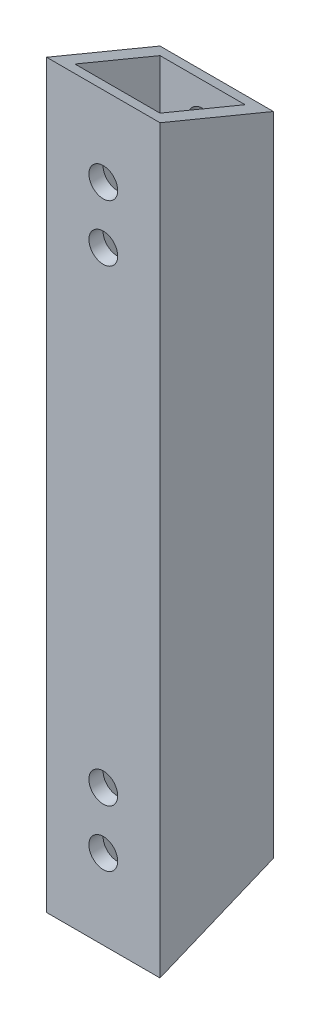
ISO-10303-21;
HEADER;
FILE_DESCRIPTION(('STEP AP214'),'2;1');
FILE_NAME('part.step','',(''),(''),'','','');
FILE_SCHEMA(('AUTOMOTIVE_DESIGN { 1 0 10303 214 1 1 1 1 }'));
ENDSEC;
DATA;
#1=APPLICATION_CONTEXT('core data for automotive mechanical design processes');
#2=APPLICATION_PROTOCOL_DEFINITION('international standard','automotive_design',2000,#1);
#3=PRODUCT_CONTEXT('',#1,'mechanical');
#4=PRODUCT('Part','Part','',(#3));
#5=PRODUCT_RELATED_PRODUCT_CATEGORY('part','',(#4));
#6=PRODUCT_DEFINITION_FORMATION('','',#4);
#7=PRODUCT_DEFINITION_CONTEXT('part definition',#1,'design');
#8=PRODUCT_DEFINITION('design','',#6,#7);
#9=PRODUCT_DEFINITION_SHAPE('','',#8);
#10=(LENGTH_UNIT() NAMED_UNIT(*) SI_UNIT(.MILLI.,.METRE.));
#11=(NAMED_UNIT(*) PLANE_ANGLE_UNIT() SI_UNIT($,.RADIAN.));
#12=(NAMED_UNIT(*) SI_UNIT($,.STERADIAN.) SOLID_ANGLE_UNIT());
#13=UNCERTAINTY_MEASURE_WITH_UNIT(LENGTH_MEASURE(1.E-05),#10,'distance_accuracy_value','');
#14=(GEOMETRIC_REPRESENTATION_CONTEXT(3) GLOBAL_UNCERTAINTY_ASSIGNED_CONTEXT((#13)) GLOBAL_UNIT_ASSIGNED_CONTEXT((#10,
#11,#12)) REPRESENTATION_CONTEXT('',''));
#15=CARTESIAN_POINT('',(0.,0.,0.));
#16=DIRECTION('',(0.,0.,1.));
#17=DIRECTION('',(1.,0.,0.));
#18=AXIS2_PLACEMENT_3D('',#15,#16,#17);
#19=CARTESIAN_POINT('',(-9.525,82.931,9.525));
#20=DIRECTION('',(0.,0.,-1.));
#21=DIRECTION('',(-1.,0.,0.));
#22=AXIS2_PLACEMENT_3D('',#19,#20,#21);
#23=PLANE('',#22);
#24=CARTESIAN_POINT('',(0.,-65.0439755157236,9.525));
#25=DIRECTION('',(0.,0.,-1.));
#26=DIRECTION('',(-1.,0.,0.));
#27=AXIS2_PLACEMENT_3D('',#24,#25,#26);
#28=CIRCLE('',#27,3.22238805970149);
#29=CARTESIAN_POINT('',(-3.22238805970149,-65.0439755157236,9.525));
#30=VERTEX_POINT('',#29);
#31=EDGE_CURVE('E173',#30,#30,#28,.T.);
#32=ORIENTED_EDGE('',*,*,#31,.F.);
#33=EDGE_LOOP('',(#32));
#34=FACE_BOUND('',#33,.T.);
#35=CARTESIAN_POINT('',(0.,52.3439755157236,9.525));
#36=DIRECTION('',(0.,0.,-1.));
#37=DIRECTION('',(-1.,0.,0.));
#38=AXIS2_PLACEMENT_3D('',#35,#36,#37);
#39=CIRCLE('',#38,3.22238805970149);
#40=CARTESIAN_POINT('',(-3.22238805970149,52.3439755157236,9.525));
#41=VERTEX_POINT('',#40);
#42=EDGE_CURVE('E265',#41,#41,#39,.T.);
#43=ORIENTED_EDGE('',*,*,#42,.F.);
#44=EDGE_LOOP('',(#43));
#45=FACE_BOUND('',#44,.T.);
#46=CARTESIAN_POINT('',(0.,65.0439755157236,9.525));
#47=DIRECTION('',(0.,0.,-1.));
#48=DIRECTION('',(-1.,0.,0.));
#49=AXIS2_PLACEMENT_3D('',#46,#47,#48);
#50=CIRCLE('',#49,3.22238805970149);
#51=CARTESIAN_POINT('',(-3.22238805970149,65.0439755157236,9.525));
#52=VERTEX_POINT('',#51);
#53=EDGE_CURVE('E259',#52,#52,#50,.T.);
#54=ORIENTED_EDGE('',*,*,#53,.F.);
#55=EDGE_LOOP('',(#54));
#56=FACE_BOUND('',#55,.T.);
#57=CARTESIAN_POINT('',(0.,-52.3439755157236,9.525));
#58=DIRECTION('',(0.,0.,-1.));
#59=DIRECTION('',(-1.,0.,0.));
#60=AXIS2_PLACEMENT_3D('',#57,#58,#59);
#61=CIRCLE('',#60,3.22238805970149);
#62=CARTESIAN_POINT('',(-3.22238805970149,-52.3439755157236,9.525));
#63=VERTEX_POINT('',#62);
#64=EDGE_CURVE('E252',#63,#63,#61,.T.);
#65=ORIENTED_EDGE('',*,*,#64,.F.);
#66=EDGE_LOOP('',(#65));
#67=FACE_BOUND('',#66,.T.);
#68=DIRECTION('',(-1.,0.,0.));
#69=VECTOR('',#68,1.);
#70=CARTESIAN_POINT('',(-9.525,81.6158719394654,9.525));
#71=LINE('',#70,#69);
#72=CARTESIAN_POINT('',(9.525,81.6158719394654,9.525));
#73=VERTEX_POINT('',#72);
#74=CARTESIAN_POINT('',(-9.525,81.6158719394654,9.525));
#75=VERTEX_POINT('',#74);
#76=EDGE_CURVE('E11',#73,#75,#71,.T.);
#77=ORIENTED_EDGE('',*,*,#76,.F.);
#78=DIRECTION('',(0.,-1.,0.));
#79=VECTOR('',#78,1.);
#80=CARTESIAN_POINT('',(9.525,82.931,9.525));
#81=LINE('',#80,#79);
#82=CARTESIAN_POINT('',(9.525,-81.6158719394654,9.525));
#83=VERTEX_POINT('',#82);
#84=EDGE_CURVE('E140',#73,#83,#81,.T.);
#85=ORIENTED_EDGE('',*,*,#84,.T.);
#86=DIRECTION('',(-1.,0.,0.));
#87=VECTOR('',#86,1.);
#88=CARTESIAN_POINT('',(-9.525,-81.6158719394654,9.525));
#89=LINE('',#88,#87);
#90=CARTESIAN_POINT('',(-9.525,-81.6158719394654,9.525));
#91=VERTEX_POINT('',#90);
#92=EDGE_CURVE('E49',#83,#91,#89,.T.);
#93=ORIENTED_EDGE('',*,*,#92,.T.);
#94=DIRECTION('',(0.,-1.,0.));
#95=VECTOR('',#94,1.);
#96=CARTESIAN_POINT('',(-9.525,82.931,9.525));
#97=LINE('',#96,#95);
#98=EDGE_CURVE('E138',#75,#91,#97,.T.);
#99=ORIENTED_EDGE('',*,*,#98,.F.);
#100=EDGE_LOOP('',(#77,#85,#93,#99));
#101=FACE_BOUND('',#100,.T.);
#102=ADVANCED_FACE('F41',(#34,#45,#56,#67,#101),#23,.T.);
#103=CARTESIAN_POINT('',(-9.525,82.931,9.525));
#104=DIRECTION('',(1.,0.,0.));
#105=DIRECTION('',(0.,0.,-1.));
#106=AXIS2_PLACEMENT_3D('',#103,#104,#105);
#107=PLANE('',#106);
#108=DIRECTION('',(0.,-0.382683432365085,-0.923879532511289));
#109=VECTOR('',#108,1.);
#110=CARTESIAN_POINT('',(-9.525,81.8084679848664,9.98996798486634));
#111=LINE('',#110,#109);
#112=CARTESIAN_POINT('',(-9.525,73.7251035762581,-9.525));
#113=VERTEX_POINT('',#112);
#114=EDGE_CURVE('E147',#75,#113,#111,.T.);
#115=ORIENTED_EDGE('',*,*,#114,.F.);
#116=ORIENTED_EDGE('',*,*,#98,.T.);
#117=DIRECTION('',(0.,0.382683432365085,-0.923879532511289));
#118=VECTOR('',#117,1.);
#119=CARTESIAN_POINT('',(-9.525,-57.5185404554486,-48.6511044857146));
#120=LINE('',#119,#118);
#121=CARTESIAN_POINT('',(-9.525,-73.7251035762581,-9.525));
#122=VERTEX_POINT('',#121);
#123=EDGE_CURVE('E63',#91,#122,#120,.T.);
#124=ORIENTED_EDGE('',*,*,#123,.T.);
#125=DIRECTION('',(0.,-1.,0.));
#126=VECTOR('',#125,1.);
#127=CARTESIAN_POINT('',(-9.525,82.931,-9.525));
#128=LINE('',#127,#126);
#129=EDGE_CURVE('E148',#113,#122,#128,.T.);
#130=ORIENTED_EDGE('',*,*,#129,.F.);
#131=EDGE_LOOP('',(#115,#116,#124,#130));
#132=FACE_BOUND('',#131,.T.);
#133=ADVANCED_FACE('F144',(#132),#107,.T.);
#134=CARTESIAN_POINT('',(-9.525,82.931,-9.525));
#135=DIRECTION('',(0.,0.,1.));
#136=DIRECTION('',(1.,0.,0.));
#137=AXIS2_PLACEMENT_3D('',#134,#135,#136);
#138=PLANE('',#137);
#139=CARTESIAN_POINT('',(0.,-65.0439755157236,-9.525));
#140=DIRECTION('',(0.,0.,1.));
#141=DIRECTION('',(1.,0.,0.));
#142=AXIS2_PLACEMENT_3D('',#139,#140,#141);
#143=CIRCLE('',#142,3.22238805970149);
#144=CARTESIAN_POINT('',(3.22238805970149,-65.0439755157236,-9.525));
#145=VERTEX_POINT('',#144);
#146=EDGE_CURVE('E268',#145,#145,#143,.T.);
#147=ORIENTED_EDGE('',*,*,#146,.F.);
#148=EDGE_LOOP('',(#147));
#149=FACE_BOUND('',#148,.T.);
#150=CARTESIAN_POINT('',(0.,52.3439755157236,-9.525));
#151=DIRECTION('',(0.,0.,1.));
#152=DIRECTION('',(1.,0.,0.));
#153=AXIS2_PLACEMENT_3D('',#150,#151,#152);
#154=CIRCLE('',#153,3.22238805970149);
#155=CARTESIAN_POINT('',(3.22238805970149,52.3439755157236,-9.525));
#156=VERTEX_POINT('',#155);
#157=EDGE_CURVE('E262',#156,#156,#154,.T.);
#158=ORIENTED_EDGE('',*,*,#157,.F.);
#159=EDGE_LOOP('',(#158));
#160=FACE_BOUND('',#159,.T.);
#161=CARTESIAN_POINT('',(0.,65.0439755157236,-9.525));
#162=DIRECTION('',(0.,0.,1.));
#163=DIRECTION('',(1.,0.,0.));
#164=AXIS2_PLACEMENT_3D('',#161,#162,#163);
#165=CIRCLE('',#164,3.22238805970149);
#166=CARTESIAN_POINT('',(3.22238805970149,65.0439755157236,-9.525));
#167=VERTEX_POINT('',#166);
#168=EDGE_CURVE('E256',#167,#167,#165,.T.);
#169=ORIENTED_EDGE('',*,*,#168,.F.);
#170=EDGE_LOOP('',(#169));
#171=FACE_BOUND('',#170,.T.);
#172=CARTESIAN_POINT('',(0.,-52.3439755157236,-9.525));
#173=DIRECTION('',(0.,0.,1.));
#174=DIRECTION('',(1.,0.,0.));
#175=AXIS2_PLACEMENT_3D('',#172,#173,#174);
#176=CIRCLE('',#175,3.22238805970149);
#177=CARTESIAN_POINT('',(3.22238805970149,-52.3439755157236,-9.525));
#178=VERTEX_POINT('',#177);
#179=EDGE_CURVE('E249',#178,#178,#176,.T.);
#180=ORIENTED_EDGE('',*,*,#179,.F.);
#181=EDGE_LOOP('',(#180));
#182=FACE_BOUND('',#181,.T.);
#183=DIRECTION('',(1.,0.,0.));
#184=VECTOR('',#183,1.);
#185=CARTESIAN_POINT('',(-9.525,73.7251035762581,-9.525));
#186=LINE('',#185,#184);
#187=CARTESIAN_POINT('',(9.525,73.7251035762581,-9.525));
#188=VERTEX_POINT('',#187);
#189=EDGE_CURVE('E184',#113,#188,#186,.T.);
#190=ORIENTED_EDGE('',*,*,#189,.F.);
#191=ORIENTED_EDGE('',*,*,#129,.T.);
#192=DIRECTION('',(1.,0.,0.));
#193=VECTOR('',#192,1.);
#194=CARTESIAN_POINT('',(-9.525,-73.7251035762581,-9.525));
#195=LINE('',#194,#193);
#196=CARTESIAN_POINT('',(9.525,-73.7251035762581,-9.525));
#197=VERTEX_POINT('',#196);
#198=EDGE_CURVE('E178',#122,#197,#195,.T.);
#199=ORIENTED_EDGE('',*,*,#198,.T.);
#200=DIRECTION('',(0.,-1.,0.));
#201=VECTOR('',#200,1.);
#202=CARTESIAN_POINT('',(9.525,82.931,-9.525));
#203=LINE('',#202,#201);
#204=EDGE_CURVE('E150',#188,#197,#203,.T.);
#205=ORIENTED_EDGE('',*,*,#204,.F.);
#206=EDGE_LOOP('',(#190,#191,#199,#205));
#207=FACE_BOUND('',#206,.T.);
#208=ADVANCED_FACE('F190',(#149,#160,#171,#182,#207),#138,.T.);
#209=CARTESIAN_POINT('',(9.525,82.931,9.525));
#210=DIRECTION('',(-1.,0.,0.));
#211=DIRECTION('',(0.,0.,1.));
#212=AXIS2_PLACEMENT_3D('',#209,#210,#211);
#213=PLANE('',#212);
#214=DIRECTION('',(0.,0.382683432365085,0.923879532511289));
#215=VECTOR('',#214,1.);
#216=CARTESIAN_POINT('',(9.525,81.8084679848664,9.98996798486634));
#217=LINE('',#216,#215);
#218=EDGE_CURVE('E55',#188,#73,#217,.T.);
#219=ORIENTED_EDGE('',*,*,#218,.F.);
#220=ORIENTED_EDGE('',*,*,#204,.T.);
#221=DIRECTION('',(0.,-0.382683432365085,0.923879532511289));
#222=VECTOR('',#221,1.);
#223=CARTESIAN_POINT('',(9.525,-57.5185404554486,-48.6511044857146));
#224=LINE('',#223,#222);
#225=EDGE_CURVE('E181',#197,#83,#224,.T.);
#226=ORIENTED_EDGE('',*,*,#225,.T.);
#227=ORIENTED_EDGE('',*,*,#84,.F.);
#228=EDGE_LOOP('',(#219,#220,#226,#227));
#229=FACE_BOUND('',#228,.T.);
#230=ADVANCED_FACE('F189',(#229),#213,.T.);
#231=CARTESIAN_POINT('',(-12.7,-66.2959081747566,-27.4606642958251));
#232=DIRECTION('',(0.,-0.923879532511289,-0.382683432365085));
#233=DIRECTION('',(0.,0.382683432365085,-0.923879532511289));
#234=AXIS2_PLACEMENT_3D('',#231,#232,#233);
#235=PLANE('',#234);
#236=ORIENTED_EDGE('',*,*,#198,.F.);
#237=ORIENTED_EDGE('',*,*,#123,.F.);
#238=ORIENTED_EDGE('',*,*,#92,.F.);
#239=ORIENTED_EDGE('',*,*,#225,.F.);
#240=EDGE_LOOP('',(#236,#237,#238,#239));
#241=FACE_BOUND('',#240,.T.);
#242=DIRECTION('',(0.,0.382683432365085,-0.923879532511289));
#243=VECTOR('',#242,1.);
#244=CARTESIAN_POINT('',(12.7,-66.2959081747566,-27.4606642958251));
#245=LINE('',#244,#243);
#246=CARTESIAN_POINT('',(12.7,-82.931,12.7));
#247=VERTEX_POINT('',#246);
#248=CARTESIAN_POINT('',(12.7,-72.4099755157236,-12.7));
#249=VERTEX_POINT('',#248);
#250=EDGE_CURVE('E165',#247,#249,#245,.T.);
#251=ORIENTED_EDGE('',*,*,#250,.F.);
#252=DIRECTION('',(1.,0.,0.));
#253=VECTOR('',#252,1.);
#254=CARTESIAN_POINT('',(-12.7,-82.931,12.7));
#255=LINE('',#254,#253);
#256=CARTESIAN_POINT('',(-12.7,-82.931,12.7));
#257=VERTEX_POINT('',#256);
#258=EDGE_CURVE('E157',#257,#247,#255,.T.);
#259=ORIENTED_EDGE('',*,*,#258,.F.);
#260=DIRECTION('',(0.,0.382683432365085,-0.923879532511289));
#261=VECTOR('',#260,1.);
#262=CARTESIAN_POINT('',(-12.7,-66.2959081747566,-27.4606642958251));
#263=LINE('',#262,#261);
#264=CARTESIAN_POINT('',(-12.7,-72.4099755157236,-12.7));
#265=VERTEX_POINT('',#264);
#266=EDGE_CURVE('E170',#257,#265,#263,.T.);
#267=ORIENTED_EDGE('',*,*,#266,.T.);
#268=DIRECTION('',(1.,0.,0.));
#269=VECTOR('',#268,1.);
#270=CARTESIAN_POINT('',(-12.7,-72.4099755157236,-12.7));
#271=LINE('',#270,#269);
#272=EDGE_CURVE('E127',#265,#249,#271,.T.);
#273=ORIENTED_EDGE('',*,*,#272,.T.);
#274=EDGE_LOOP('',(#251,#259,#267,#273));
#275=FACE_BOUND('',#274,.T.);
#276=ADVANCED_FACE('F169',(#241,#275),#235,.T.);
#277=CARTESIAN_POINT('',(-12.7,66.2959081747566,-27.4606642958251));
#278=DIRECTION('',(0.,-0.923879532511289,0.382683432365085));
#279=DIRECTION('',(0.,-0.382683432365085,-0.923879532511289));
#280=AXIS2_PLACEMENT_3D('',#277,#278,#279);
#281=PLANE('',#280);
#282=ORIENTED_EDGE('',*,*,#218,.T.);
#283=ORIENTED_EDGE('',*,*,#76,.T.);
#284=ORIENTED_EDGE('',*,*,#114,.T.);
#285=ORIENTED_EDGE('',*,*,#189,.T.);
#286=EDGE_LOOP('',(#282,#283,#284,#285));
#287=FACE_BOUND('',#286,.T.);
#288=DIRECTION('',(0.,-0.382683432365085,-0.923879532511289));
#289=VECTOR('',#288,1.);
#290=CARTESIAN_POINT('',(12.7,66.2959081747566,-27.4606642958251));
#291=LINE('',#290,#289);
#292=CARTESIAN_POINT('',(12.7,82.931,12.7));
#293=VERTEX_POINT('',#292);
#294=CARTESIAN_POINT('',(12.7,72.4099755157236,-12.7));
#295=VERTEX_POINT('',#294);
#296=EDGE_CURVE('E110',#293,#295,#291,.T.);
#297=ORIENTED_EDGE('',*,*,#296,.T.);
#298=DIRECTION('',(1.,0.,0.));
#299=VECTOR('',#298,1.);
#300=CARTESIAN_POINT('',(-12.7,72.4099755157236,-12.7));
#301=LINE('',#300,#299);
#302=CARTESIAN_POINT('',(-12.7,72.4099755157236,-12.7));
#303=VERTEX_POINT('',#302);
#304=EDGE_CURVE('E104',#303,#295,#301,.T.);
#305=ORIENTED_EDGE('',*,*,#304,.F.);
#306=DIRECTION('',(0.,-0.382683432365085,-0.923879532511289));
#307=VECTOR('',#306,1.);
#308=CARTESIAN_POINT('',(-12.7,66.2959081747566,-27.4606642958251));
#309=LINE('',#308,#307);
#310=CARTESIAN_POINT('',(-12.7,82.931,12.7));
#311=VERTEX_POINT('',#310);
#312=EDGE_CURVE('E107',#311,#303,#309,.T.);
#313=ORIENTED_EDGE('',*,*,#312,.F.);
#314=DIRECTION('',(1.,0.,0.));
#315=VECTOR('',#314,1.);
#316=CARTESIAN_POINT('',(-12.7,82.931,12.7));
#317=LINE('',#316,#315);
#318=EDGE_CURVE('E158',#311,#293,#317,.T.);
#319=ORIENTED_EDGE('',*,*,#318,.T.);
#320=EDGE_LOOP('',(#297,#305,#313,#319));
#321=FACE_BOUND('',#320,.T.);
#322=ADVANCED_FACE('F106',(#287,#321),#281,.F.);
#323=CARTESIAN_POINT('',(12.7,82.931,12.7));
#324=DIRECTION('',(-1.,0.,0.));
#325=DIRECTION('',(0.,0.,1.));
#326=AXIS2_PLACEMENT_3D('',#323,#324,#325);
#327=PLANE('',#326);
#328=DIRECTION('',(0.,-1.,0.));
#329=VECTOR('',#328,1.);
#330=CARTESIAN_POINT('',(12.7,82.931,-12.7));
#331=LINE('',#330,#329);
#332=EDGE_CURVE('E128',#295,#249,#331,.T.);
#333=ORIENTED_EDGE('',*,*,#332,.F.);
#334=ORIENTED_EDGE('',*,*,#296,.F.);
#335=DIRECTION('',(0.,-1.,0.));
#336=VECTOR('',#335,1.);
#337=CARTESIAN_POINT('',(12.7,82.931,12.7));
#338=LINE('',#337,#336);
#339=EDGE_CURVE('E131',#293,#247,#338,.T.);
#340=ORIENTED_EDGE('',*,*,#339,.T.);
#341=ORIENTED_EDGE('',*,*,#250,.T.);
#342=EDGE_LOOP('',(#333,#334,#340,#341));
#343=FACE_BOUND('',#342,.T.);
#344=ADVANCED_FACE('F43',(#343),#327,.F.);
#345=CARTESIAN_POINT('',(-12.7,82.931,-12.7));
#346=DIRECTION('',(0.,0.,1.));
#347=DIRECTION('',(1.,0.,0.));
#348=AXIS2_PLACEMENT_3D('',#345,#346,#347);
#349=PLANE('',#348);
#350=CARTESIAN_POINT('',(0.,-65.0439755157236,-12.7));
#351=DIRECTION('',(0.,0.,-1.));
#352=DIRECTION('',(-1.,0.,0.));
#353=AXIS2_PLACEMENT_3D('',#350,#351,#352);
#354=CIRCLE('',#353,3.22238805970149);
#355=CARTESIAN_POINT('',(-3.22238805970149,-65.0439755157236,-12.7));
#356=VERTEX_POINT('',#355);
#357=EDGE_CURVE('E225',#356,#356,#354,.T.);
#358=ORIENTED_EDGE('',*,*,#357,.F.);
#359=EDGE_LOOP('',(#358));
#360=FACE_BOUND('',#359,.T.);
#361=CARTESIAN_POINT('',(0.,52.3439755157236,-12.7));
#362=DIRECTION('',(0.,0.,-1.));
#363=DIRECTION('',(1.,0.,0.));
#364=AXIS2_PLACEMENT_3D('',#361,#362,#363);
#365=CIRCLE('',#364,3.22238805970149);
#366=CARTESIAN_POINT('',(3.22238805970149,52.3439755157236,-12.7));
#367=VERTEX_POINT('',#366);
#368=EDGE_CURVE('E229',#367,#367,#365,.T.);
#369=ORIENTED_EDGE('',*,*,#368,.F.);
#370=EDGE_LOOP('',(#369));
#371=FACE_BOUND('',#370,.T.);
#372=CARTESIAN_POINT('',(0.,65.0439755157236,-12.7));
#373=DIRECTION('',(0.,0.,-1.));
#374=DIRECTION('',(1.,0.,0.));
#375=AXIS2_PLACEMENT_3D('',#372,#373,#374);
#376=CIRCLE('',#375,3.22238805970149);
#377=CARTESIAN_POINT('',(3.22238805970149,65.0439755157236,-12.7));
#378=VERTEX_POINT('',#377);
#379=EDGE_CURVE('E233',#378,#378,#376,.T.);
#380=ORIENTED_EDGE('',*,*,#379,.F.);
#381=EDGE_LOOP('',(#380));
#382=FACE_BOUND('',#381,.T.);
#383=CARTESIAN_POINT('',(0.,-52.3439755157236,-12.7));
#384=DIRECTION('',(0.,0.,-1.));
#385=DIRECTION('',(-1.,0.,0.));
#386=AXIS2_PLACEMENT_3D('',#383,#384,#385);
#387=CIRCLE('',#386,3.22238805970149);
#388=CARTESIAN_POINT('',(-3.22238805970149,-52.3439755157236,-12.7));
#389=VERTEX_POINT('',#388);
#390=EDGE_CURVE('E236',#389,#389,#387,.T.);
#391=ORIENTED_EDGE('',*,*,#390,.F.);
#392=EDGE_LOOP('',(#391));
#393=FACE_BOUND('',#392,.T.);
#394=DIRECTION('',(0.,-1.,0.));
#395=VECTOR('',#394,1.);
#396=CARTESIAN_POINT('',(-12.7,82.931,-12.7));
#397=LINE('',#396,#395);
#398=EDGE_CURVE('E120',#303,#265,#397,.T.);
#399=ORIENTED_EDGE('',*,*,#398,.F.);
#400=ORIENTED_EDGE('',*,*,#304,.T.);
#401=ORIENTED_EDGE('',*,*,#332,.T.);
#402=ORIENTED_EDGE('',*,*,#272,.F.);
#403=EDGE_LOOP('',(#399,#400,#401,#402));
#404=FACE_BOUND('',#403,.T.);
#405=ADVANCED_FACE('F126',(#360,#371,#382,#393,#404),#349,.F.);
#406=CARTESIAN_POINT('',(-12.7,82.931,12.7));
#407=DIRECTION('',(1.,0.,0.));
#408=DIRECTION('',(0.,0.,-1.));
#409=AXIS2_PLACEMENT_3D('',#406,#407,#408);
#410=PLANE('',#409);
#411=DIRECTION('',(0.,-1.,0.));
#412=VECTOR('',#411,1.);
#413=CARTESIAN_POINT('',(-12.7,82.931,12.7));
#414=LINE('',#413,#412);
#415=EDGE_CURVE('E122',#311,#257,#414,.T.);
#416=ORIENTED_EDGE('',*,*,#415,.F.);
#417=ORIENTED_EDGE('',*,*,#312,.T.);
#418=ORIENTED_EDGE('',*,*,#398,.T.);
#419=ORIENTED_EDGE('',*,*,#266,.F.);
#420=EDGE_LOOP('',(#416,#417,#418,#419));
#421=FACE_BOUND('',#420,.T.);
#422=ADVANCED_FACE('F118',(#421),#410,.F.);
#423=CARTESIAN_POINT('',(-12.7,82.931,12.7));
#424=DIRECTION('',(0.,0.,-1.));
#425=DIRECTION('',(-1.,0.,0.));
#426=AXIS2_PLACEMENT_3D('',#423,#424,#425);
#427=PLANE('',#426);
#428=CARTESIAN_POINT('',(0.,-65.0439755157236,12.7));
#429=DIRECTION('',(0.,0.,-1.));
#430=DIRECTION('',(-1.,0.,0.));
#431=AXIS2_PLACEMENT_3D('',#428,#429,#430);
#432=CIRCLE('',#431,3.22238805970149);
#433=CARTESIAN_POINT('',(-3.22238805970149,-65.0439755157236,12.7));
#434=VERTEX_POINT('',#433);
#435=EDGE_CURVE('E253',#434,#434,#432,.T.);
#436=ORIENTED_EDGE('',*,*,#435,.T.);
#437=EDGE_LOOP('',(#436));
#438=FACE_BOUND('',#437,.T.);
#439=CARTESIAN_POINT('',(0.,52.3439755157236,12.7));
#440=DIRECTION('',(0.,0.,-1.));
#441=DIRECTION('',(1.,0.,0.));
#442=AXIS2_PLACEMENT_3D('',#439,#440,#441);
#443=CIRCLE('',#442,3.22238805970149);
#444=CARTESIAN_POINT('',(3.22238805970149,52.3439755157236,12.7));
#445=VERTEX_POINT('',#444);
#446=EDGE_CURVE('E248',#445,#445,#443,.T.);
#447=ORIENTED_EDGE('',*,*,#446,.T.);
#448=EDGE_LOOP('',(#447));
#449=FACE_BOUND('',#448,.T.);
#450=CARTESIAN_POINT('',(0.,65.0439755157236,12.7));
#451=DIRECTION('',(0.,0.,-1.));
#452=DIRECTION('',(1.,0.,0.));
#453=AXIS2_PLACEMENT_3D('',#450,#451,#452);
#454=CIRCLE('',#453,3.22238805970149);
#455=CARTESIAN_POINT('',(3.22238805970149,65.0439755157236,12.7));
#456=VERTEX_POINT('',#455);
#457=EDGE_CURVE('E239',#456,#456,#454,.T.);
#458=ORIENTED_EDGE('',*,*,#457,.T.);
#459=EDGE_LOOP('',(#458));
#460=FACE_BOUND('',#459,.T.);
#461=CARTESIAN_POINT('',(0.,-52.3439755157236,12.7));
#462=DIRECTION('',(0.,0.,-1.));
#463=DIRECTION('',(-1.,0.,0.));
#464=AXIS2_PLACEMENT_3D('',#461,#462,#463);
#465=CIRCLE('',#464,3.22238805970149);
#466=CARTESIAN_POINT('',(-3.22238805970149,-52.3439755157236,12.7));
#467=VERTEX_POINT('',#466);
#468=EDGE_CURVE('E238',#467,#467,#465,.T.);
#469=ORIENTED_EDGE('',*,*,#468,.T.);
#470=EDGE_LOOP('',(#469));
#471=FACE_BOUND('',#470,.T.);
#472=ORIENTED_EDGE('',*,*,#258,.T.);
#473=ORIENTED_EDGE('',*,*,#339,.F.);
#474=ORIENTED_EDGE('',*,*,#318,.F.);
#475=ORIENTED_EDGE('',*,*,#415,.T.);
#476=EDGE_LOOP('',(#472,#473,#474,#475));
#477=FACE_BOUND('',#476,.T.);
#478=ADVANCED_FACE('F167',(#438,#449,#460,#471,#477),#427,.F.);
#479=CARTESIAN_POINT('',(0.,-52.3439755157236,12.7));
#480=DIRECTION('',(0.,0.,-1.));
#481=DIRECTION('',(-1.,0.,0.));
#482=AXIS2_PLACEMENT_3D('',#479,#480,#481);
#483=CYLINDRICAL_SURFACE('',#482,3.22238805970149);
#484=ORIENTED_EDGE('',*,*,#64,.T.);
#485=EDGE_LOOP('',(#484));
#486=FACE_BOUND('',#485,.T.);
#487=ORIENTED_EDGE('',*,*,#468,.F.);
#488=EDGE_LOOP('',(#487));
#489=FACE_BOUND('',#488,.T.);
#490=ADVANCED_FACE('F214',(#486,#489),#483,.F.);
#491=CARTESIAN_POINT('',(0.,65.0439755157236,12.7));
#492=DIRECTION('',(0.,0.,-1.));
#493=DIRECTION('',(-1.,0.,0.));
#494=AXIS2_PLACEMENT_3D('',#491,#492,#493);
#495=CYLINDRICAL_SURFACE('',#494,3.22238805970149);
#496=ORIENTED_EDGE('',*,*,#53,.T.);
#497=EDGE_LOOP('',(#496));
#498=FACE_BOUND('',#497,.T.);
#499=ORIENTED_EDGE('',*,*,#457,.F.);
#500=EDGE_LOOP('',(#499));
#501=FACE_BOUND('',#500,.T.);
#502=ADVANCED_FACE('F299',(#498,#501),#495,.F.);
#503=CARTESIAN_POINT('',(0.,52.3439755157236,12.7));
#504=DIRECTION('',(0.,0.,-1.));
#505=DIRECTION('',(-1.,0.,0.));
#506=AXIS2_PLACEMENT_3D('',#503,#504,#505);
#507=CYLINDRICAL_SURFACE('',#506,3.22238805970149);
#508=ORIENTED_EDGE('',*,*,#42,.T.);
#509=EDGE_LOOP('',(#508));
#510=FACE_BOUND('',#509,.T.);
#511=ORIENTED_EDGE('',*,*,#446,.F.);
#512=EDGE_LOOP('',(#511));
#513=FACE_BOUND('',#512,.T.);
#514=ADVANCED_FACE('F277',(#510,#513),#507,.F.);
#515=CARTESIAN_POINT('',(0.,-65.0439755157236,12.7));
#516=DIRECTION('',(0.,0.,-1.));
#517=DIRECTION('',(-1.,0.,0.));
#518=AXIS2_PLACEMENT_3D('',#515,#516,#517);
#519=CYLINDRICAL_SURFACE('',#518,3.22238805970149);
#520=ORIENTED_EDGE('',*,*,#31,.T.);
#521=EDGE_LOOP('',(#520));
#522=FACE_BOUND('',#521,.T.);
#523=ORIENTED_EDGE('',*,*,#435,.F.);
#524=EDGE_LOOP('',(#523));
#525=FACE_BOUND('',#524,.T.);
#526=ADVANCED_FACE('F273',(#522,#525),#519,.F.);
#527=ORIENTED_EDGE('',*,*,#179,.T.);
#528=EDGE_LOOP('',(#527));
#529=FACE_BOUND('',#528,.T.);
#530=ORIENTED_EDGE('',*,*,#390,.T.);
#531=EDGE_LOOP('',(#530));
#532=FACE_BOUND('',#531,.T.);
#533=ADVANCED_FACE('F276',(#529,#532),#483,.F.);
#534=ORIENTED_EDGE('',*,*,#168,.T.);
#535=EDGE_LOOP('',(#534));
#536=FACE_BOUND('',#535,.T.);
#537=ORIENTED_EDGE('',*,*,#379,.T.);
#538=EDGE_LOOP('',(#537));
#539=FACE_BOUND('',#538,.T.);
#540=ADVANCED_FACE('F289',(#536,#539),#495,.F.);
#541=ORIENTED_EDGE('',*,*,#157,.T.);
#542=EDGE_LOOP('',(#541));
#543=FACE_BOUND('',#542,.T.);
#544=ORIENTED_EDGE('',*,*,#368,.T.);
#545=EDGE_LOOP('',(#544));
#546=FACE_BOUND('',#545,.T.);
#547=ADVANCED_FACE('F287',(#543,#546),#507,.F.);
#548=ORIENTED_EDGE('',*,*,#146,.T.);
#549=EDGE_LOOP('',(#548));
#550=FACE_BOUND('',#549,.T.);
#551=ORIENTED_EDGE('',*,*,#357,.T.);
#552=EDGE_LOOP('',(#551));
#553=FACE_BOUND('',#552,.T.);
#554=ADVANCED_FACE('F279',(#550,#553),#519,.F.);
#555=CLOSED_SHELL('',(#102,#133,#208,#230,#276,#322,#344,#405,#422,#478,#490,#502,#514,#526,
#533,#540,#547,#554));
#556=MANIFOLD_SOLID_BREP('B2',#555);
#557=ADVANCED_BREP_SHAPE_REPRESENTATION('',(#18,#556),#14);
#558=SHAPE_DEFINITION_REPRESENTATION(#9,#557);
ENDSEC;
END-ISO-10303-21;
